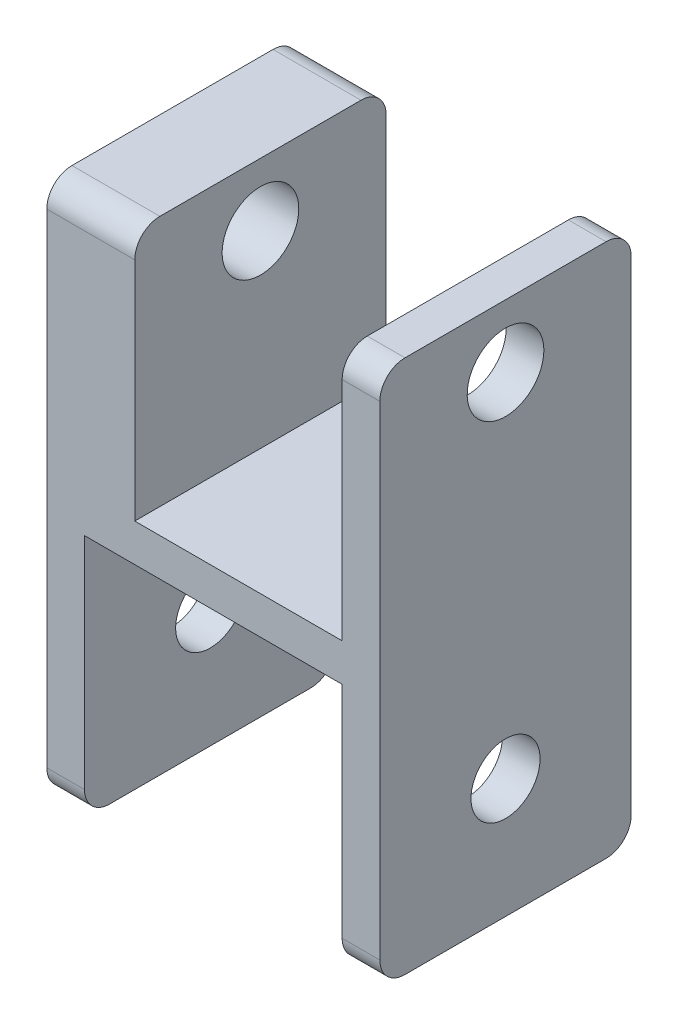
ISO-10303-21;
HEADER;
FILE_DESCRIPTION(('STEP AP214'),'2;1');
FILE_NAME('part.step','',(''),(''),'','','');
FILE_SCHEMA(('AUTOMOTIVE_DESIGN { 1 0 10303 214 1 1 1 1 }'));
ENDSEC;
DATA;
#1=APPLICATION_CONTEXT('core data for automotive mechanical design processes');
#2=APPLICATION_PROTOCOL_DEFINITION('international standard','automotive_design',2000,#1);
#3=PRODUCT_CONTEXT('',#1,'mechanical');
#4=PRODUCT('Part','Part','',(#3));
#5=PRODUCT_RELATED_PRODUCT_CATEGORY('part','',(#4));
#6=PRODUCT_DEFINITION_FORMATION('','',#4);
#7=PRODUCT_DEFINITION_CONTEXT('part definition',#1,'design');
#8=PRODUCT_DEFINITION('design','',#6,#7);
#9=PRODUCT_DEFINITION_SHAPE('','',#8);
#10=(LENGTH_UNIT() NAMED_UNIT(*) SI_UNIT(.MILLI.,.METRE.));
#11=(NAMED_UNIT(*) PLANE_ANGLE_UNIT() SI_UNIT($,.RADIAN.));
#12=(NAMED_UNIT(*) SI_UNIT($,.STERADIAN.) SOLID_ANGLE_UNIT());
#13=UNCERTAINTY_MEASURE_WITH_UNIT(LENGTH_MEASURE(1.E-05),#10,'distance_accuracy_value','');
#14=(GEOMETRIC_REPRESENTATION_CONTEXT(3) GLOBAL_UNCERTAINTY_ASSIGNED_CONTEXT((#13)) GLOBAL_UNIT_ASSIGNED_CONTEXT((#10,
#11,#12)) REPRESENTATION_CONTEXT('',''));
#15=CARTESIAN_POINT('',(0.,0.,0.));
#16=DIRECTION('',(0.,0.,1.));
#17=DIRECTION('',(1.,0.,0.));
#18=AXIS2_PLACEMENT_3D('',#15,#16,#17);
#19=CARTESIAN_POINT('',(-10.25,1.5,20.));
#20=DIRECTION('',(0.,-1.,0.));
#21=DIRECTION('',(0.,0.,-1.));
#22=AXIS2_PLACEMENT_3D('',#19,#20,#21);
#23=PLANE('',#22);
#24=DIRECTION('',(0.,0.,-1.));
#25=VECTOR('',#24,1.);
#26=CARTESIAN_POINT('',(-6.25,1.5,0.));
#27=LINE('',#26,#25);
#28=CARTESIAN_POINT('',(-6.25,1.5,20.));
#29=VERTEX_POINT('',#28);
#30=CARTESIAN_POINT('',(-6.25,1.5,0.));
#31=VERTEX_POINT('',#30);
#32=EDGE_CURVE('E382',#29,#31,#27,.T.);
#33=ORIENTED_EDGE('',*,*,#32,.F.);
#34=DIRECTION('',(-1.,0.,0.));
#35=VECTOR('',#34,1.);
#36=CARTESIAN_POINT('',(-10.25,1.5,20.));
#37=LINE('',#36,#35);
#38=CARTESIAN_POINT('',(10.25,1.5,20.));
#39=VERTEX_POINT('',#38);
#40=EDGE_CURVE('E213',#39,#29,#37,.T.);
#41=ORIENTED_EDGE('',*,*,#40,.F.);
#42=DIRECTION('',(0.,0.,-1.));
#43=VECTOR('',#42,1.);
#44=CARTESIAN_POINT('',(10.25,1.5,20.));
#45=LINE('',#44,#43);
#46=CARTESIAN_POINT('',(10.25,1.5,0.));
#47=VERTEX_POINT('',#46);
#48=EDGE_CURVE('E236',#39,#47,#45,.T.);
#49=ORIENTED_EDGE('',*,*,#48,.T.);
#50=DIRECTION('',(-1.,0.,0.));
#51=VECTOR('',#50,1.);
#52=CARTESIAN_POINT('',(-10.25,1.5,0.));
#53=LINE('',#52,#51);
#54=EDGE_CURVE('E232',#47,#31,#53,.T.);
#55=ORIENTED_EDGE('',*,*,#54,.T.);
#56=EDGE_LOOP('',(#33,#41,#49,#55));
#57=FACE_BOUND('',#56,.T.);
#58=ADVANCED_FACE('F39',(#57),#23,.F.);
#59=CARTESIAN_POINT('',(-13.25,21.5,20.));
#60=DIRECTION('',(1.,0.,0.));
#61=DIRECTION('',(0.,1.,0.));
#62=AXIS2_PLACEMENT_3D('',#59,#60,#61);
#63=PLANE('',#62);
#64=CARTESIAN_POINT('',(-13.25,16.5,10.));
#65=DIRECTION('',(1.,0.,0.));
#66=DIRECTION('',(0.,1.,0.));
#67=AXIS2_PLACEMENT_3D('',#64,#65,#66);
#68=CIRCLE('',#67,3.05);
#69=CARTESIAN_POINT('',(-13.25,19.55,10.));
#70=VERTEX_POINT('',#69);
#71=EDGE_CURVE('E374',#70,#70,#68,.T.);
#72=ORIENTED_EDGE('',*,*,#71,.T.);
#73=EDGE_LOOP('',(#72));
#74=FACE_BOUND('',#73,.T.);
#75=CARTESIAN_POINT('',(-13.25,-11.5,10.));
#76=DIRECTION('',(1.,0.,0.));
#77=DIRECTION('',(0.,1.,0.));
#78=AXIS2_PLACEMENT_3D('',#75,#76,#77);
#79=CIRCLE('',#78,2.75);
#80=CARTESIAN_POINT('',(-13.25,-8.75,10.));
#81=VERTEX_POINT('',#80);
#82=EDGE_CURVE('E365',#81,#81,#79,.T.);
#83=ORIENTED_EDGE('',*,*,#82,.T.);
#84=EDGE_LOOP('',(#83));
#85=FACE_BOUND('',#84,.T.);
#86=DIRECTION('',(0.,-1.,0.));
#87=VECTOR('',#86,1.);
#88=CARTESIAN_POINT('',(-13.25,21.5,0.));
#89=LINE('',#88,#87);
#90=CARTESIAN_POINT('',(-13.25,19.5,0.));
#91=VERTEX_POINT('',#90);
#92=CARTESIAN_POINT('',(-13.25,-19.,0.));
#93=VERTEX_POINT('',#92);
#94=EDGE_CURVE('E217',#91,#93,#89,.T.);
#95=ORIENTED_EDGE('',*,*,#94,.T.);
#96=CARTESIAN_POINT('',(-13.25,-19.,2.));
#97=DIRECTION('',(1.,0.,0.));
#98=DIRECTION('',(0.,1.,0.));
#99=AXIS2_PLACEMENT_3D('',#96,#97,#98);
#100=CIRCLE('',#99,2.);
#101=CARTESIAN_POINT('',(-13.25,-21.,2.));
#102=VERTEX_POINT('',#101);
#103=EDGE_CURVE('E296',#93,#102,#100,.F.);
#104=ORIENTED_EDGE('',*,*,#103,.T.);
#105=DIRECTION('',(0.,0.,-1.));
#106=VECTOR('',#105,1.);
#107=CARTESIAN_POINT('',(-13.25,-21.,20.));
#108=LINE('',#107,#106);
#109=CARTESIAN_POINT('',(-13.25,-21.,18.));
#110=VERTEX_POINT('',#109);
#111=EDGE_CURVE('E253',#110,#102,#108,.T.);
#112=ORIENTED_EDGE('',*,*,#111,.F.);
#113=CARTESIAN_POINT('',(-13.25,-19.,18.));
#114=DIRECTION('',(1.,0.,0.));
#115=DIRECTION('',(0.,1.,0.));
#116=AXIS2_PLACEMENT_3D('',#113,#114,#115);
#117=CIRCLE('',#116,2.);
#118=CARTESIAN_POINT('',(-13.25,-19.,20.));
#119=VERTEX_POINT('',#118);
#120=EDGE_CURVE('E294',#110,#119,#117,.F.);
#121=ORIENTED_EDGE('',*,*,#120,.T.);
#122=DIRECTION('',(0.,-1.,0.));
#123=VECTOR('',#122,1.);
#124=CARTESIAN_POINT('',(-13.25,21.5,20.));
#125=LINE('',#124,#123);
#126=CARTESIAN_POINT('',(-13.25,19.5,20.));
#127=VERTEX_POINT('',#126);
#128=EDGE_CURVE('E187',#127,#119,#125,.T.);
#129=ORIENTED_EDGE('',*,*,#128,.F.);
#130=CARTESIAN_POINT('',(-13.25,19.5,18.));
#131=DIRECTION('',(1.,0.,0.));
#132=DIRECTION('',(0.,1.,0.));
#133=AXIS2_PLACEMENT_3D('',#130,#131,#132);
#134=CIRCLE('',#133,2.);
#135=CARTESIAN_POINT('',(-13.25,21.5,18.));
#136=VERTEX_POINT('',#135);
#137=EDGE_CURVE('E290',#127,#136,#134,.F.);
#138=ORIENTED_EDGE('',*,*,#137,.T.);
#139=DIRECTION('',(0.,0.,-1.));
#140=VECTOR('',#139,1.);
#141=CARTESIAN_POINT('',(-13.25,21.5,20.));
#142=LINE('',#141,#140);
#143=CARTESIAN_POINT('',(-13.25,21.5,2.));
#144=VERTEX_POINT('',#143);
#145=EDGE_CURVE('E216',#136,#144,#142,.T.);
#146=ORIENTED_EDGE('',*,*,#145,.T.);
#147=CARTESIAN_POINT('',(-13.25,19.5,2.));
#148=DIRECTION('',(1.,0.,0.));
#149=DIRECTION('',(0.,1.,0.));
#150=AXIS2_PLACEMENT_3D('',#147,#148,#149);
#151=CIRCLE('',#150,2.);
#152=EDGE_CURVE('E292',#144,#91,#151,.F.);
#153=ORIENTED_EDGE('',*,*,#152,.T.);
#154=EDGE_LOOP('',(#95,#104,#112,#121,#129,#138,#146,#153));
#155=FACE_BOUND('',#154,.T.);
#156=ADVANCED_FACE('F335',(#74,#85,#155),#63,.F.);
#157=CARTESIAN_POINT('',(-13.25,-21.,20.));
#158=DIRECTION('',(0.,1.,0.));
#159=DIRECTION('',(0.,0.,1.));
#160=AXIS2_PLACEMENT_3D('',#157,#158,#159);
#161=PLANE('',#160);
#162=ORIENTED_EDGE('',*,*,#111,.T.);
#163=DIRECTION('',(1.,0.,0.));
#164=VECTOR('',#163,1.);
#165=CARTESIAN_POINT('',(-13.25,-21.,2.));
#166=LINE('',#165,#164);
#167=CARTESIAN_POINT('',(-10.25,-21.,2.));
#168=VERTEX_POINT('',#167);
#169=EDGE_CURVE('E283',#102,#168,#166,.T.);
#170=ORIENTED_EDGE('',*,*,#169,.T.);
#171=DIRECTION('',(0.,0.,-1.));
#172=VECTOR('',#171,1.);
#173=CARTESIAN_POINT('',(-10.25,-21.,20.));
#174=LINE('',#173,#172);
#175=CARTESIAN_POINT('',(-10.25,-21.,18.));
#176=VERTEX_POINT('',#175);
#177=EDGE_CURVE('E197',#176,#168,#174,.T.);
#178=ORIENTED_EDGE('',*,*,#177,.F.);
#179=DIRECTION('',(1.,0.,0.));
#180=VECTOR('',#179,1.);
#181=CARTESIAN_POINT('',(-13.25,-21.,18.));
#182=LINE('',#181,#180);
#183=EDGE_CURVE('E281',#176,#110,#182,.F.);
#184=ORIENTED_EDGE('',*,*,#183,.T.);
#185=EDGE_LOOP('',(#162,#170,#178,#184));
#186=FACE_BOUND('',#185,.T.);
#187=ADVANCED_FACE('F354',(#186),#161,.F.);
#188=CARTESIAN_POINT('',(-10.25,-1.5,20.));
#189=DIRECTION('',(-1.,0.,0.));
#190=DIRECTION('',(0.,-1.,0.));
#191=AXIS2_PLACEMENT_3D('',#188,#189,#190);
#192=PLANE('',#191);
#193=CARTESIAN_POINT('',(-10.25,-11.5,10.));
#194=DIRECTION('',(-1.,0.,0.));
#195=DIRECTION('',(0.,-1.,0.));
#196=AXIS2_PLACEMENT_3D('',#193,#194,#195);
#197=CIRCLE('',#196,2.75);
#198=CARTESIAN_POINT('',(-10.25,-14.25,10.));
#199=VERTEX_POINT('',#198);
#200=EDGE_CURVE('E220',#199,#199,#197,.T.);
#201=ORIENTED_EDGE('',*,*,#200,.T.);
#202=EDGE_LOOP('',(#201));
#203=FACE_BOUND('',#202,.T.);
#204=ORIENTED_EDGE('',*,*,#177,.T.);
#205=CARTESIAN_POINT('',(-10.25,-19.,2.));
#206=DIRECTION('',(-1.,0.,0.));
#207=DIRECTION('',(0.,-1.,0.));
#208=AXIS2_PLACEMENT_3D('',#205,#206,#207);
#209=CIRCLE('',#208,2.);
#210=CARTESIAN_POINT('',(-10.25,-19.,0.));
#211=VERTEX_POINT('',#210);
#212=EDGE_CURVE('E288',#168,#211,#209,.F.);
#213=ORIENTED_EDGE('',*,*,#212,.T.);
#214=DIRECTION('',(0.,1.,0.));
#215=VECTOR('',#214,1.);
#216=CARTESIAN_POINT('',(-10.25,-1.5,0.));
#217=LINE('',#216,#215);
#218=CARTESIAN_POINT('',(-10.25,-1.5,0.));
#219=VERTEX_POINT('',#218);
#220=EDGE_CURVE('E194',#211,#219,#217,.T.);
#221=ORIENTED_EDGE('',*,*,#220,.T.);
#222=DIRECTION('',(0.,0.,-1.));
#223=VECTOR('',#222,1.);
#224=CARTESIAN_POINT('',(-10.25,-1.5,20.));
#225=LINE('',#224,#223);
#226=CARTESIAN_POINT('',(-10.25,-1.5,20.));
#227=VERTEX_POINT('',#226);
#228=EDGE_CURVE('E190',#227,#219,#225,.T.);
#229=ORIENTED_EDGE('',*,*,#228,.F.);
#230=DIRECTION('',(0.,1.,0.));
#231=VECTOR('',#230,1.);
#232=CARTESIAN_POINT('',(-10.25,-1.5,20.));
#233=LINE('',#232,#231);
#234=CARTESIAN_POINT('',(-10.25,-19.,20.));
#235=VERTEX_POINT('',#234);
#236=EDGE_CURVE('E176',#235,#227,#233,.T.);
#237=ORIENTED_EDGE('',*,*,#236,.F.);
#238=CARTESIAN_POINT('',(-10.25,-19.,18.));
#239=DIRECTION('',(-1.,0.,0.));
#240=DIRECTION('',(0.,-1.,0.));
#241=AXIS2_PLACEMENT_3D('',#238,#239,#240);
#242=CIRCLE('',#241,2.);
#243=EDGE_CURVE('E286',#235,#176,#242,.F.);
#244=ORIENTED_EDGE('',*,*,#243,.T.);
#245=EDGE_LOOP('',(#204,#213,#221,#229,#237,#244));
#246=FACE_BOUND('',#245,.T.);
#247=ADVANCED_FACE('F192',(#203,#246),#192,.F.);
#248=CARTESIAN_POINT('',(-10.25,-1.5,20.));
#249=DIRECTION('',(0.,1.,0.));
#250=DIRECTION('',(0.,0.,1.));
#251=AXIS2_PLACEMENT_3D('',#248,#249,#250);
#252=PLANE('',#251);
#253=DIRECTION('',(1.,0.,0.));
#254=VECTOR('',#253,1.);
#255=CARTESIAN_POINT('',(-10.25,-1.5,0.));
#256=LINE('',#255,#254);
#257=CARTESIAN_POINT('',(10.25,-1.5,0.));
#258=VERTEX_POINT('',#257);
#259=EDGE_CURVE('E222',#219,#258,#256,.T.);
#260=ORIENTED_EDGE('',*,*,#259,.T.);
#261=DIRECTION('',(0.,0.,-1.));
#262=VECTOR('',#261,1.);
#263=CARTESIAN_POINT('',(10.25,-1.5,20.));
#264=LINE('',#263,#262);
#265=CARTESIAN_POINT('',(10.25,-1.5,20.));
#266=VERTEX_POINT('',#265);
#267=EDGE_CURVE('E198',#266,#258,#264,.T.);
#268=ORIENTED_EDGE('',*,*,#267,.F.);
#269=DIRECTION('',(1.,0.,0.));
#270=VECTOR('',#269,1.);
#271=CARTESIAN_POINT('',(-10.25,-1.5,20.));
#272=LINE('',#271,#270);
#273=EDGE_CURVE('E182',#227,#266,#272,.T.);
#274=ORIENTED_EDGE('',*,*,#273,.F.);
#275=ORIENTED_EDGE('',*,*,#228,.T.);
#276=EDGE_LOOP('',(#260,#268,#274,#275));
#277=FACE_BOUND('',#276,.T.);
#278=ADVANCED_FACE('F200',(#277),#252,.F.);
#279=CARTESIAN_POINT('',(10.25,-1.5,20.));
#280=DIRECTION('',(1.,0.,0.));
#281=DIRECTION('',(0.,1.,0.));
#282=AXIS2_PLACEMENT_3D('',#279,#280,#281);
#283=PLANE('',#282);
#284=CARTESIAN_POINT('',(10.25,-11.5,10.));
#285=DIRECTION('',(1.,0.,0.));
#286=DIRECTION('',(0.,1.,0.));
#287=AXIS2_PLACEMENT_3D('',#284,#285,#286);
#288=CIRCLE('',#287,2.75);
#289=CARTESIAN_POINT('',(10.25,-8.75,10.));
#290=VERTEX_POINT('',#289);
#291=EDGE_CURVE('E362',#290,#290,#288,.T.);
#292=ORIENTED_EDGE('',*,*,#291,.T.);
#293=EDGE_LOOP('',(#292));
#294=FACE_BOUND('',#293,.T.);
#295=DIRECTION('',(0.,-1.,0.));
#296=VECTOR('',#295,1.);
#297=CARTESIAN_POINT('',(10.25,-1.5,0.));
#298=LINE('',#297,#296);
#299=CARTESIAN_POINT('',(10.25,-19.,0.));
#300=VERTEX_POINT('',#299);
#301=EDGE_CURVE('E224',#258,#300,#298,.T.);
#302=ORIENTED_EDGE('',*,*,#301,.T.);
#303=CARTESIAN_POINT('',(10.25,-19.,2.));
#304=DIRECTION('',(1.,0.,0.));
#305=DIRECTION('',(0.,1.,0.));
#306=AXIS2_PLACEMENT_3D('',#303,#304,#305);
#307=CIRCLE('',#306,2.);
#308=CARTESIAN_POINT('',(10.25,-21.,2.));
#309=VERTEX_POINT('',#308);
#310=EDGE_CURVE('E279',#300,#309,#307,.F.);
#311=ORIENTED_EDGE('',*,*,#310,.T.);
#312=DIRECTION('',(0.,0.,-1.));
#313=VECTOR('',#312,1.);
#314=CARTESIAN_POINT('',(10.25,-21.,20.));
#315=LINE('',#314,#313);
#316=CARTESIAN_POINT('',(10.25,-21.,18.));
#317=VERTEX_POINT('',#316);
#318=EDGE_CURVE('E248',#317,#309,#315,.T.);
#319=ORIENTED_EDGE('',*,*,#318,.F.);
#320=CARTESIAN_POINT('',(10.25,-19.,18.));
#321=DIRECTION('',(1.,0.,0.));
#322=DIRECTION('',(0.,1.,0.));
#323=AXIS2_PLACEMENT_3D('',#320,#321,#322);
#324=CIRCLE('',#323,2.);
#325=CARTESIAN_POINT('',(10.25,-19.,20.));
#326=VERTEX_POINT('',#325);
#327=EDGE_CURVE('E277',#317,#326,#324,.F.);
#328=ORIENTED_EDGE('',*,*,#327,.T.);
#329=DIRECTION('',(0.,-1.,0.));
#330=VECTOR('',#329,1.);
#331=CARTESIAN_POINT('',(10.25,-1.5,20.));
#332=LINE('',#331,#330);
#333=EDGE_CURVE('E203',#266,#326,#332,.T.);
#334=ORIENTED_EDGE('',*,*,#333,.F.);
#335=ORIENTED_EDGE('',*,*,#267,.T.);
#336=EDGE_LOOP('',(#302,#311,#319,#328,#334,#335));
#337=FACE_BOUND('',#336,.T.);
#338=ADVANCED_FACE('F427',(#294,#337),#283,.F.);
#339=CARTESIAN_POINT('',(10.25,-21.,20.));
#340=DIRECTION('',(0.,1.,0.));
#341=DIRECTION('',(0.,0.,1.));
#342=AXIS2_PLACEMENT_3D('',#339,#340,#341);
#343=PLANE('',#342);
#344=ORIENTED_EDGE('',*,*,#318,.T.);
#345=DIRECTION('',(1.,0.,0.));
#346=VECTOR('',#345,1.);
#347=CARTESIAN_POINT('',(10.25,-21.,2.));
#348=LINE('',#347,#346);
#349=CARTESIAN_POINT('',(13.25,-21.,2.));
#350=VERTEX_POINT('',#349);
#351=EDGE_CURVE('E258',#309,#350,#348,.T.);
#352=ORIENTED_EDGE('',*,*,#351,.T.);
#353=DIRECTION('',(0.,0.,-1.));
#354=VECTOR('',#353,1.);
#355=CARTESIAN_POINT('',(13.25,-21.,20.));
#356=LINE('',#355,#354);
#357=CARTESIAN_POINT('',(13.25,-21.,18.));
#358=VERTEX_POINT('',#357);
#359=EDGE_CURVE('E245',#358,#350,#356,.T.);
#360=ORIENTED_EDGE('',*,*,#359,.F.);
#361=DIRECTION('',(1.,0.,0.));
#362=VECTOR('',#361,1.);
#363=CARTESIAN_POINT('',(10.25,-21.,18.));
#364=LINE('',#363,#362);
#365=EDGE_CURVE('E256',#358,#317,#364,.F.);
#366=ORIENTED_EDGE('',*,*,#365,.T.);
#367=EDGE_LOOP('',(#344,#352,#360,#366));
#368=FACE_BOUND('',#367,.T.);
#369=ADVANCED_FACE('F423',(#368),#343,.F.);
#370=CARTESIAN_POINT('',(13.25,21.5,20.));
#371=DIRECTION('',(-1.,0.,0.));
#372=DIRECTION('',(0.,-1.,0.));
#373=AXIS2_PLACEMENT_3D('',#370,#371,#372);
#374=PLANE('',#373);
#375=CARTESIAN_POINT('',(13.25,16.5,10.));
#376=DIRECTION('',(1.,0.,0.));
#377=DIRECTION('',(0.,1.,0.));
#378=AXIS2_PLACEMENT_3D('',#375,#376,#377);
#379=CIRCLE('',#378,3.05);
#380=CARTESIAN_POINT('',(13.25,19.55,10.));
#381=VERTEX_POINT('',#380);
#382=EDGE_CURVE('E332',#381,#381,#379,.T.);
#383=ORIENTED_EDGE('',*,*,#382,.F.);
#384=EDGE_LOOP('',(#383));
#385=FACE_BOUND('',#384,.T.);
#386=CARTESIAN_POINT('',(13.25,-11.5,10.));
#387=DIRECTION('',(1.,0.,0.));
#388=DIRECTION('',(0.,1.,0.));
#389=AXIS2_PLACEMENT_3D('',#386,#387,#388);
#390=CIRCLE('',#389,2.75);
#391=CARTESIAN_POINT('',(13.25,-8.75,10.));
#392=VERTEX_POINT('',#391);
#393=EDGE_CURVE('E366',#392,#392,#390,.T.);
#394=ORIENTED_EDGE('',*,*,#393,.F.);
#395=EDGE_LOOP('',(#394));
#396=FACE_BOUND('',#395,.T.);
#397=ORIENTED_EDGE('',*,*,#359,.T.);
#398=CARTESIAN_POINT('',(13.25,-19.,2.));
#399=DIRECTION('',(-1.,0.,0.));
#400=DIRECTION('',(0.,-1.,0.));
#401=AXIS2_PLACEMENT_3D('',#398,#399,#400);
#402=CIRCLE('',#401,2.);
#403=CARTESIAN_POINT('',(13.25,-19.,0.));
#404=VERTEX_POINT('',#403);
#405=EDGE_CURVE('E267',#350,#404,#402,.F.);
#406=ORIENTED_EDGE('',*,*,#405,.T.);
#407=DIRECTION('',(0.,1.,0.));
#408=VECTOR('',#407,1.);
#409=CARTESIAN_POINT('',(13.25,21.5,0.));
#410=LINE('',#409,#408);
#411=CARTESIAN_POINT('',(13.25,19.5,0.));
#412=VERTEX_POINT('',#411);
#413=EDGE_CURVE('E227',#404,#412,#410,.T.);
#414=ORIENTED_EDGE('',*,*,#413,.T.);
#415=CARTESIAN_POINT('',(13.25,19.5,2.));
#416=DIRECTION('',(-1.,0.,0.));
#417=DIRECTION('',(0.,-1.,0.));
#418=AXIS2_PLACEMENT_3D('',#415,#416,#417);
#419=CIRCLE('',#418,2.);
#420=CARTESIAN_POINT('',(13.25,21.5,2.));
#421=VERTEX_POINT('',#420);
#422=EDGE_CURVE('E263',#412,#421,#419,.F.);
#423=ORIENTED_EDGE('',*,*,#422,.T.);
#424=DIRECTION('',(0.,0.,-1.));
#425=VECTOR('',#424,1.);
#426=CARTESIAN_POINT('',(13.25,21.5,20.));
#427=LINE('',#426,#425);
#428=CARTESIAN_POINT('',(13.25,21.5,18.));
#429=VERTEX_POINT('',#428);
#430=EDGE_CURVE('E242',#429,#421,#427,.T.);
#431=ORIENTED_EDGE('',*,*,#430,.F.);
#432=CARTESIAN_POINT('',(13.25,19.5,18.));
#433=DIRECTION('',(-1.,0.,0.));
#434=DIRECTION('',(0.,-1.,0.));
#435=AXIS2_PLACEMENT_3D('',#432,#433,#434);
#436=CIRCLE('',#435,2.);
#437=CARTESIAN_POINT('',(13.25,19.5,20.));
#438=VERTEX_POINT('',#437);
#439=EDGE_CURVE('E261',#429,#438,#436,.F.);
#440=ORIENTED_EDGE('',*,*,#439,.T.);
#441=DIRECTION('',(0.,1.,0.));
#442=VECTOR('',#441,1.);
#443=CARTESIAN_POINT('',(13.25,21.5,20.));
#444=LINE('',#443,#442);
#445=CARTESIAN_POINT('',(13.25,-19.,20.));
#446=VERTEX_POINT('',#445);
#447=EDGE_CURVE('E205',#446,#438,#444,.T.);
#448=ORIENTED_EDGE('',*,*,#447,.F.);
#449=CARTESIAN_POINT('',(13.25,-19.,18.));
#450=DIRECTION('',(-1.,0.,0.));
#451=DIRECTION('',(0.,-1.,0.));
#452=AXIS2_PLACEMENT_3D('',#449,#450,#451);
#453=CIRCLE('',#452,2.);
#454=EDGE_CURVE('E265',#446,#358,#453,.F.);
#455=ORIENTED_EDGE('',*,*,#454,.T.);
#456=EDGE_LOOP('',(#397,#406,#414,#423,#431,#440,#448,#455));
#457=FACE_BOUND('',#456,.T.);
#458=ADVANCED_FACE('F419',(#385,#396,#457),#374,.F.);
#459=CARTESIAN_POINT('',(10.25,21.5,20.));
#460=DIRECTION('',(0.,-1.,0.));
#461=DIRECTION('',(1.,0.,0.));
#462=AXIS2_PLACEMENT_3D('',#459,#460,#461);
#463=PLANE('',#462);
#464=ORIENTED_EDGE('',*,*,#430,.T.);
#465=DIRECTION('',(-1.,0.,0.));
#466=VECTOR('',#465,1.);
#467=CARTESIAN_POINT('',(10.25,21.5,2.));
#468=LINE('',#467,#466);
#469=CARTESIAN_POINT('',(10.25,21.5,2.));
#470=VERTEX_POINT('',#469);
#471=EDGE_CURVE('E310',#421,#470,#468,.T.);
#472=ORIENTED_EDGE('',*,*,#471,.T.);
#473=DIRECTION('',(0.,0.,-1.));
#474=VECTOR('',#473,1.);
#475=CARTESIAN_POINT('',(10.25,21.5,20.));
#476=LINE('',#475,#474);
#477=CARTESIAN_POINT('',(10.25,21.5,18.));
#478=VERTEX_POINT('',#477);
#479=EDGE_CURVE('E239',#478,#470,#476,.T.);
#480=ORIENTED_EDGE('',*,*,#479,.F.);
#481=DIRECTION('',(-1.,0.,0.));
#482=VECTOR('',#481,1.);
#483=CARTESIAN_POINT('',(13.25,21.5,18.));
#484=LINE('',#483,#482);
#485=EDGE_CURVE('E308',#478,#429,#484,.F.);
#486=ORIENTED_EDGE('',*,*,#485,.T.);
#487=EDGE_LOOP('',(#464,#472,#480,#486));
#488=FACE_BOUND('',#487,.T.);
#489=ADVANCED_FACE('F415',(#488),#463,.F.);
#490=CARTESIAN_POINT('',(10.25,21.5,20.));
#491=DIRECTION('',(1.,0.,0.));
#492=DIRECTION('',(0.,1.,0.));
#493=AXIS2_PLACEMENT_3D('',#490,#491,#492);
#494=PLANE('',#493);
#495=CARTESIAN_POINT('',(10.25,16.5,10.));
#496=DIRECTION('',(1.,0.,0.));
#497=DIRECTION('',(0.,1.,0.));
#498=AXIS2_PLACEMENT_3D('',#495,#496,#497);
#499=CIRCLE('',#498,3.05);
#500=CARTESIAN_POINT('',(10.25,19.55,10.));
#501=VERTEX_POINT('',#500);
#502=EDGE_CURVE('E369',#501,#501,#499,.T.);
#503=ORIENTED_EDGE('',*,*,#502,.T.);
#504=EDGE_LOOP('',(#503));
#505=FACE_BOUND('',#504,.T.);
#506=ORIENTED_EDGE('',*,*,#479,.T.);
#507=CARTESIAN_POINT('',(10.25,19.5,2.));
#508=DIRECTION('',(1.,0.,0.));
#509=DIRECTION('',(0.,1.,0.));
#510=AXIS2_PLACEMENT_3D('',#507,#508,#509);
#511=CIRCLE('',#510,2.);
#512=CARTESIAN_POINT('',(10.25,19.5,0.));
#513=VERTEX_POINT('',#512);
#514=EDGE_CURVE('E315',#470,#513,#511,.F.);
#515=ORIENTED_EDGE('',*,*,#514,.T.);
#516=DIRECTION('',(0.,-1.,0.));
#517=VECTOR('',#516,1.);
#518=CARTESIAN_POINT('',(10.25,21.5,0.));
#519=LINE('',#518,#517);
#520=EDGE_CURVE('E230',#513,#47,#519,.T.);
#521=ORIENTED_EDGE('',*,*,#520,.T.);
#522=ORIENTED_EDGE('',*,*,#48,.F.);
#523=DIRECTION('',(0.,-1.,0.));
#524=VECTOR('',#523,1.);
#525=CARTESIAN_POINT('',(10.25,21.5,20.));
#526=LINE('',#525,#524);
#527=CARTESIAN_POINT('',(10.25,19.5,20.));
#528=VERTEX_POINT('',#527);
#529=EDGE_CURVE('E211',#528,#39,#526,.T.);
#530=ORIENTED_EDGE('',*,*,#529,.F.);
#531=CARTESIAN_POINT('',(10.25,19.5,18.));
#532=DIRECTION('',(1.,0.,0.));
#533=DIRECTION('',(0.,1.,0.));
#534=AXIS2_PLACEMENT_3D('',#531,#532,#533);
#535=CIRCLE('',#534,2.);
#536=EDGE_CURVE('E313',#528,#478,#535,.F.);
#537=ORIENTED_EDGE('',*,*,#536,.T.);
#538=EDGE_LOOP('',(#506,#515,#521,#522,#530,#537));
#539=FACE_BOUND('',#538,.T.);
#540=ADVANCED_FACE('F412',(#505,#539),#494,.F.);
#541=CARTESIAN_POINT('',(-13.25,21.5,20.));
#542=DIRECTION('',(0.,-1.,0.));
#543=DIRECTION('',(1.,0.,0.));
#544=AXIS2_PLACEMENT_3D('',#541,#542,#543);
#545=PLANE('',#544);
#546=DIRECTION('',(0.,0.,1.));
#547=VECTOR('',#546,1.);
#548=CARTESIAN_POINT('',(-6.25,21.5,20.));
#549=LINE('',#548,#547);
#550=CARTESIAN_POINT('',(-6.25,21.5,2.));
#551=VERTEX_POINT('',#550);
#552=CARTESIAN_POINT('',(-6.25,21.5,18.));
#553=VERTEX_POINT('',#552);
#554=EDGE_CURVE('E327',#551,#553,#549,.T.);
#555=ORIENTED_EDGE('',*,*,#554,.F.);
#556=DIRECTION('',(-1.,0.,0.));
#557=VECTOR('',#556,1.);
#558=CARTESIAN_POINT('',(-13.25,21.5,2.));
#559=LINE('',#558,#557);
#560=EDGE_CURVE('E318',#551,#144,#559,.T.);
#561=ORIENTED_EDGE('',*,*,#560,.T.);
#562=ORIENTED_EDGE('',*,*,#145,.F.);
#563=DIRECTION('',(-1.,0.,0.));
#564=VECTOR('',#563,1.);
#565=CARTESIAN_POINT('',(-6.25,21.5,18.));
#566=LINE('',#565,#564);
#567=EDGE_CURVE('E54',#136,#553,#566,.F.);
#568=ORIENTED_EDGE('',*,*,#567,.T.);
#569=EDGE_LOOP('',(#555,#561,#562,#568));
#570=FACE_BOUND('',#569,.T.);
#571=ADVANCED_FACE('F336',(#570),#545,.F.);
#572=CARTESIAN_POINT('',(0.,0.,20.));
#573=DIRECTION('',(0.,0.,1.));
#574=DIRECTION('',(1.,0.,0.));
#575=AXIS2_PLACEMENT_3D('',#572,#573,#574);
#576=PLANE('',#575);
#577=ORIENTED_EDGE('',*,*,#128,.T.);
#578=DIRECTION('',(1.,0.,0.));
#579=VECTOR('',#578,1.);
#580=CARTESIAN_POINT('',(-10.25,-19.,20.));
#581=LINE('',#580,#579);
#582=EDGE_CURVE('E185',#119,#235,#581,.T.);
#583=ORIENTED_EDGE('',*,*,#582,.T.);
#584=ORIENTED_EDGE('',*,*,#236,.T.);
#585=ORIENTED_EDGE('',*,*,#273,.T.);
#586=ORIENTED_EDGE('',*,*,#333,.T.);
#587=DIRECTION('',(1.,0.,0.));
#588=VECTOR('',#587,1.);
#589=CARTESIAN_POINT('',(13.25,-19.,20.));
#590=LINE('',#589,#588);
#591=EDGE_CURVE('E304',#326,#446,#590,.T.);
#592=ORIENTED_EDGE('',*,*,#591,.T.);
#593=ORIENTED_EDGE('',*,*,#447,.T.);
#594=DIRECTION('',(-1.,0.,0.));
#595=VECTOR('',#594,1.);
#596=CARTESIAN_POINT('',(10.25,19.5,20.));
#597=LINE('',#596,#595);
#598=EDGE_CURVE('E301',#438,#528,#597,.T.);
#599=ORIENTED_EDGE('',*,*,#598,.T.);
#600=ORIENTED_EDGE('',*,*,#529,.T.);
#601=ORIENTED_EDGE('',*,*,#40,.T.);
#602=DIRECTION('',(0.,-1.,0.));
#603=VECTOR('',#602,1.);
#604=CARTESIAN_POINT('',(-6.25,1.5,20.));
#605=LINE('',#604,#603);
#606=CARTESIAN_POINT('',(-6.25,19.5,20.));
#607=VERTEX_POINT('',#606);
#608=EDGE_CURVE('E325',#607,#29,#605,.T.);
#609=ORIENTED_EDGE('',*,*,#608,.F.);
#610=DIRECTION('',(-1.,0.,0.));
#611=VECTOR('',#610,1.);
#612=CARTESIAN_POINT('',(-13.25,19.5,20.));
#613=LINE('',#612,#611);
#614=EDGE_CURVE('E298',#607,#127,#613,.T.);
#615=ORIENTED_EDGE('',*,*,#614,.T.);
#616=EDGE_LOOP('',(#577,#583,#584,#585,#586,#592,#593,#599,#600,#601,#609,#615));
#617=FACE_BOUND('',#616,.T.);
#618=ADVANCED_FACE('F179',(#617),#576,.T.);
#619=CARTESIAN_POINT('',(0.,0.,0.));
#620=DIRECTION('',(0.,0.,1.));
#621=DIRECTION('',(1.,0.,0.));
#622=AXIS2_PLACEMENT_3D('',#619,#620,#621);
#623=PLANE('',#622);
#624=ORIENTED_EDGE('',*,*,#413,.F.);
#625=DIRECTION('',(1.,0.,0.));
#626=VECTOR('',#625,1.);
#627=CARTESIAN_POINT('',(0.,-19.,0.));
#628=LINE('',#627,#626);
#629=EDGE_CURVE('E275',#404,#300,#628,.F.);
#630=ORIENTED_EDGE('',*,*,#629,.T.);
#631=ORIENTED_EDGE('',*,*,#301,.F.);
#632=ORIENTED_EDGE('',*,*,#259,.F.);
#633=ORIENTED_EDGE('',*,*,#220,.F.);
#634=DIRECTION('',(1.,0.,0.));
#635=VECTOR('',#634,1.);
#636=CARTESIAN_POINT('',(0.,-19.,0.));
#637=LINE('',#636,#635);
#638=EDGE_CURVE('E273',#211,#93,#637,.F.);
#639=ORIENTED_EDGE('',*,*,#638,.T.);
#640=ORIENTED_EDGE('',*,*,#94,.F.);
#641=DIRECTION('',(-1.,0.,0.));
#642=VECTOR('',#641,1.);
#643=CARTESIAN_POINT('',(0.,19.5,0.));
#644=LINE('',#643,#642);
#645=CARTESIAN_POINT('',(-6.25,19.5,0.));
#646=VERTEX_POINT('',#645);
#647=EDGE_CURVE('E269',#91,#646,#644,.F.);
#648=ORIENTED_EDGE('',*,*,#647,.T.);
#649=DIRECTION('',(0.,1.,0.));
#650=VECTOR('',#649,1.);
#651=CARTESIAN_POINT('',(-6.25,1.5,0.));
#652=LINE('',#651,#650);
#653=EDGE_CURVE('E380',#31,#646,#652,.T.);
#654=ORIENTED_EDGE('',*,*,#653,.F.);
#655=ORIENTED_EDGE('',*,*,#54,.F.);
#656=ORIENTED_EDGE('',*,*,#520,.F.);
#657=DIRECTION('',(-1.,0.,0.));
#658=VECTOR('',#657,1.);
#659=CARTESIAN_POINT('',(0.,19.5,0.));
#660=LINE('',#659,#658);
#661=EDGE_CURVE('E271',#513,#412,#660,.F.);
#662=ORIENTED_EDGE('',*,*,#661,.T.);
#663=EDGE_LOOP('',(#624,#630,#631,#632,#633,#639,#640,#648,#654,#655,#656,#662));
#664=FACE_BOUND('',#663,.T.);
#665=ADVANCED_FACE('F345',(#664),#623,.F.);
#666=CARTESIAN_POINT('',(-13.25,-11.5,10.));
#667=DIRECTION('',(1.,0.,0.));
#668=DIRECTION('',(0.,1.,0.));
#669=AXIS2_PLACEMENT_3D('',#666,#667,#668);
#670=CYLINDRICAL_SURFACE('',#669,2.75);
#671=ORIENTED_EDGE('',*,*,#393,.T.);
#672=EDGE_LOOP('',(#671));
#673=FACE_BOUND('',#672,.T.);
#674=ORIENTED_EDGE('',*,*,#291,.F.);
#675=EDGE_LOOP('',(#674));
#676=FACE_BOUND('',#675,.T.);
#677=ADVANCED_FACE('F514',(#673,#676),#670,.F.);
#678=ORIENTED_EDGE('',*,*,#82,.F.);
#679=EDGE_LOOP('',(#678));
#680=FACE_BOUND('',#679,.T.);
#681=ORIENTED_EDGE('',*,*,#200,.F.);
#682=EDGE_LOOP('',(#681));
#683=FACE_BOUND('',#682,.T.);
#684=ADVANCED_FACE('F589',(#680,#683),#670,.F.);
#685=CARTESIAN_POINT('',(-13.25,16.5,10.));
#686=DIRECTION('',(1.,0.,0.));
#687=DIRECTION('',(0.,1.,0.));
#688=AXIS2_PLACEMENT_3D('',#685,#686,#687);
#689=CYLINDRICAL_SURFACE('',#688,3.05);
#690=ORIENTED_EDGE('',*,*,#71,.F.);
#691=EDGE_LOOP('',(#690));
#692=FACE_BOUND('',#691,.T.);
#693=CARTESIAN_POINT('',(-6.25,16.5,10.));
#694=DIRECTION('',(1.,0.,0.));
#695=DIRECTION('',(0.,1.,0.));
#696=AXIS2_PLACEMENT_3D('',#693,#694,#695);
#697=CIRCLE('',#696,3.05);
#698=CARTESIAN_POINT('',(-6.25,19.55,10.));
#699=VERTEX_POINT('',#698);
#700=EDGE_CURVE('E384',#699,#699,#697,.T.);
#701=ORIENTED_EDGE('',*,*,#700,.T.);
#702=EDGE_LOOP('',(#701));
#703=FACE_BOUND('',#702,.T.);
#704=ADVANCED_FACE('F388',(#692,#703),#689,.F.);
#705=ORIENTED_EDGE('',*,*,#382,.T.);
#706=EDGE_LOOP('',(#705));
#707=FACE_BOUND('',#706,.T.);
#708=ORIENTED_EDGE('',*,*,#502,.F.);
#709=EDGE_LOOP('',(#708));
#710=FACE_BOUND('',#709,.T.);
#711=ADVANCED_FACE('F391',(#707,#710),#689,.F.);
#712=CARTESIAN_POINT('',(-6.25,0.,0.));
#713=DIRECTION('',(-1.,0.,0.));
#714=DIRECTION('',(0.,-1.,0.));
#715=AXIS2_PLACEMENT_3D('',#712,#713,#714);
#716=PLANE('',#715);
#717=ORIENTED_EDGE('',*,*,#653,.T.);
#718=CARTESIAN_POINT('',(-6.25,19.5,2.));
#719=DIRECTION('',(-1.,0.,0.));
#720=DIRECTION('',(0.,-1.,0.));
#721=AXIS2_PLACEMENT_3D('',#718,#719,#720);
#722=CIRCLE('',#721,2.);
#723=EDGE_CURVE('E11',#646,#551,#722,.F.);
#724=ORIENTED_EDGE('',*,*,#723,.T.);
#725=ORIENTED_EDGE('',*,*,#554,.T.);
#726=CARTESIAN_POINT('',(-6.25,19.5,18.));
#727=DIRECTION('',(-1.,0.,0.));
#728=DIRECTION('',(0.,-1.,0.));
#729=AXIS2_PLACEMENT_3D('',#726,#727,#728);
#730=CIRCLE('',#729,2.);
#731=EDGE_CURVE('E47',#553,#607,#730,.F.);
#732=ORIENTED_EDGE('',*,*,#731,.T.);
#733=ORIENTED_EDGE('',*,*,#608,.T.);
#734=ORIENTED_EDGE('',*,*,#32,.T.);
#735=EDGE_LOOP('',(#717,#724,#725,#732,#733,#734));
#736=FACE_BOUND('',#735,.T.);
#737=ORIENTED_EDGE('',*,*,#700,.F.);
#738=EDGE_LOOP('',(#737));
#739=FACE_BOUND('',#738,.T.);
#740=ADVANCED_FACE('F322',(#736,#739),#716,.F.);
#741=CARTESIAN_POINT('',(10.25,-19.,2.));
#742=DIRECTION('',(1.,0.,0.));
#743=DIRECTION('',(0.,0.,-1.));
#744=AXIS2_PLACEMENT_3D('',#741,#742,#743);
#745=CYLINDRICAL_SURFACE('',#744,2.);
#746=ORIENTED_EDGE('',*,*,#310,.F.);
#747=ORIENTED_EDGE('',*,*,#629,.F.);
#748=ORIENTED_EDGE('',*,*,#405,.F.);
#749=ORIENTED_EDGE('',*,*,#351,.F.);
#750=EDGE_LOOP('',(#746,#747,#748,#749));
#751=FACE_BOUND('',#750,.T.);
#752=ADVANCED_FACE('F390',(#751),#745,.T.);
#753=CARTESIAN_POINT('',(-13.25,-19.,2.));
#754=DIRECTION('',(1.,0.,0.));
#755=DIRECTION('',(0.,0.,-1.));
#756=AXIS2_PLACEMENT_3D('',#753,#754,#755);
#757=CYLINDRICAL_SURFACE('',#756,2.);
#758=ORIENTED_EDGE('',*,*,#103,.F.);
#759=ORIENTED_EDGE('',*,*,#638,.F.);
#760=ORIENTED_EDGE('',*,*,#212,.F.);
#761=ORIENTED_EDGE('',*,*,#169,.F.);
#762=EDGE_LOOP('',(#758,#759,#760,#761));
#763=FACE_BOUND('',#762,.T.);
#764=ADVANCED_FACE('F349',(#763),#757,.T.);
#765=CARTESIAN_POINT('',(0.,-19.,18.));
#766=DIRECTION('',(-1.,0.,0.));
#767=DIRECTION('',(0.,0.,1.));
#768=AXIS2_PLACEMENT_3D('',#765,#766,#767);
#769=CYLINDRICAL_SURFACE('',#768,2.);
#770=ORIENTED_EDGE('',*,*,#120,.F.);
#771=ORIENTED_EDGE('',*,*,#183,.F.);
#772=ORIENTED_EDGE('',*,*,#243,.F.);
#773=ORIENTED_EDGE('',*,*,#582,.F.);
#774=EDGE_LOOP('',(#770,#771,#772,#773));
#775=FACE_BOUND('',#774,.T.);
#776=ADVANCED_FACE('F358',(#775),#769,.T.);
#777=CARTESIAN_POINT('',(0.,-19.,18.));
#778=DIRECTION('',(-1.,0.,0.));
#779=DIRECTION('',(0.,0.,1.));
#780=AXIS2_PLACEMENT_3D('',#777,#778,#779);
#781=CYLINDRICAL_SURFACE('',#780,2.);
#782=ORIENTED_EDGE('',*,*,#327,.F.);
#783=ORIENTED_EDGE('',*,*,#365,.F.);
#784=ORIENTED_EDGE('',*,*,#454,.F.);
#785=ORIENTED_EDGE('',*,*,#591,.F.);
#786=EDGE_LOOP('',(#782,#783,#784,#785));
#787=FACE_BOUND('',#786,.T.);
#788=ADVANCED_FACE('F443',(#787),#781,.T.);
#789=CARTESIAN_POINT('',(10.25,19.5,2.));
#790=DIRECTION('',(-1.,0.,0.));
#791=DIRECTION('',(0.,-1.,0.));
#792=AXIS2_PLACEMENT_3D('',#789,#790,#791);
#793=CYLINDRICAL_SURFACE('',#792,2.);
#794=ORIENTED_EDGE('',*,*,#422,.F.);
#795=ORIENTED_EDGE('',*,*,#661,.F.);
#796=ORIENTED_EDGE('',*,*,#514,.F.);
#797=ORIENTED_EDGE('',*,*,#471,.F.);
#798=EDGE_LOOP('',(#794,#795,#796,#797));
#799=FACE_BOUND('',#798,.T.);
#800=ADVANCED_FACE('F446',(#799),#793,.T.);
#801=CARTESIAN_POINT('',(0.,19.5,18.));
#802=DIRECTION('',(1.,0.,0.));
#803=DIRECTION('',(0.,1.,0.));
#804=AXIS2_PLACEMENT_3D('',#801,#802,#803);
#805=CYLINDRICAL_SURFACE('',#804,2.);
#806=ORIENTED_EDGE('',*,*,#439,.F.);
#807=ORIENTED_EDGE('',*,*,#485,.F.);
#808=ORIENTED_EDGE('',*,*,#536,.F.);
#809=ORIENTED_EDGE('',*,*,#598,.F.);
#810=EDGE_LOOP('',(#806,#807,#808,#809));
#811=FACE_BOUND('',#810,.T.);
#812=ADVANCED_FACE('F450',(#811),#805,.T.);
#813=CARTESIAN_POINT('',(-13.25,19.5,2.));
#814=DIRECTION('',(-1.,0.,0.));
#815=DIRECTION('',(0.,-1.,0.));
#816=AXIS2_PLACEMENT_3D('',#813,#814,#815);
#817=CYLINDRICAL_SURFACE('',#816,2.);
#818=ORIENTED_EDGE('',*,*,#723,.F.);
#819=ORIENTED_EDGE('',*,*,#647,.F.);
#820=ORIENTED_EDGE('',*,*,#152,.F.);
#821=ORIENTED_EDGE('',*,*,#560,.F.);
#822=EDGE_LOOP('',(#818,#819,#820,#821));
#823=FACE_BOUND('',#822,.T.);
#824=ADVANCED_FACE('F339',(#823),#817,.T.);
#825=CARTESIAN_POINT('',(0.,19.5,18.));
#826=DIRECTION('',(1.,0.,0.));
#827=DIRECTION('',(0.,1.,0.));
#828=AXIS2_PLACEMENT_3D('',#825,#826,#827);
#829=CYLINDRICAL_SURFACE('',#828,2.);
#830=ORIENTED_EDGE('',*,*,#731,.F.);
#831=ORIENTED_EDGE('',*,*,#567,.F.);
#832=ORIENTED_EDGE('',*,*,#137,.F.);
#833=ORIENTED_EDGE('',*,*,#614,.F.);
#834=EDGE_LOOP('',(#830,#831,#832,#833));
#835=FACE_BOUND('',#834,.T.);
#836=ADVANCED_FACE('F41',(#835),#829,.T.);
#837=CLOSED_SHELL('',(#58,#156,#187,#247,#278,#338,#369,#458,#489,#540,#571,#618,#665,#677,#684,
#704,#711,#740,#752,#764,#776,#788,#800,#812,#824,#836));
#838=MANIFOLD_SOLID_BREP('B2',#837);
#839=ADVANCED_BREP_SHAPE_REPRESENTATION('',(#18,#838),#14);
#840=SHAPE_DEFINITION_REPRESENTATION(#9,#839);
ENDSEC;
END-ISO-10303-21;
